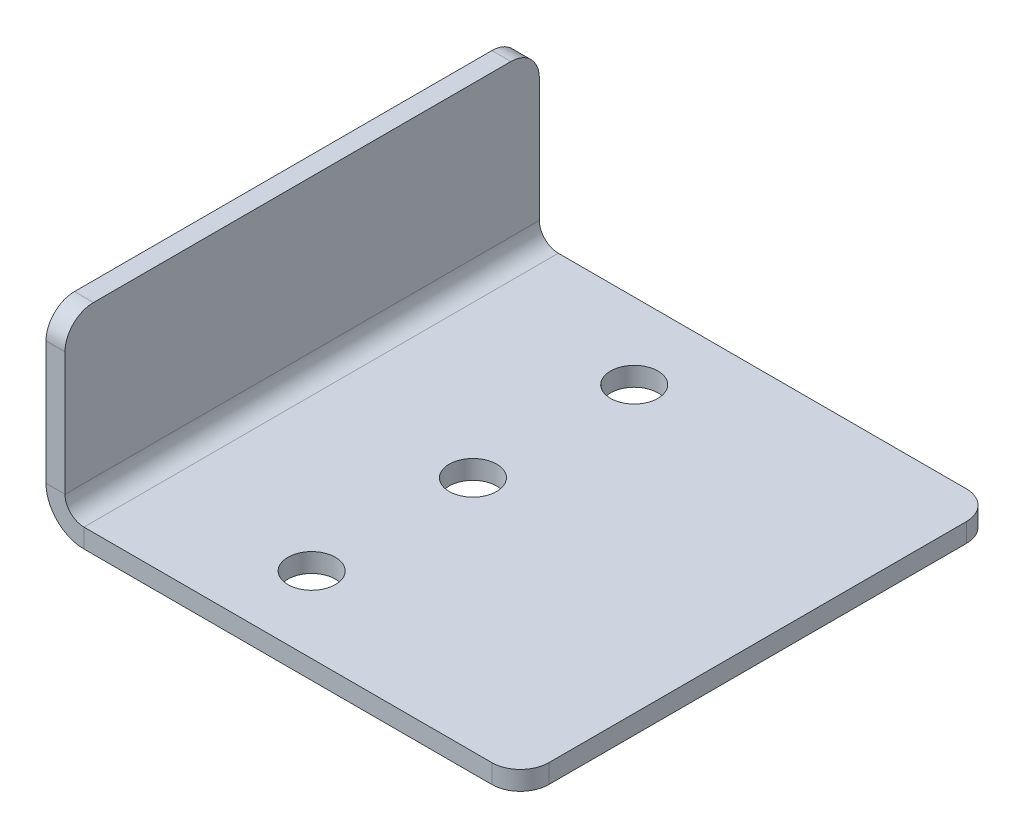
ISO-10303-21;
HEADER;
FILE_DESCRIPTION(('STEP AP214'),'2;1');
FILE_NAME('part.step','',(''),(''),'','','');
FILE_SCHEMA(('AUTOMOTIVE_DESIGN { 1 0 10303 214 1 1 1 1 }'));
ENDSEC;
DATA;
#1=APPLICATION_CONTEXT('core data for automotive mechanical design processes');
#2=APPLICATION_PROTOCOL_DEFINITION('international standard','automotive_design',2000,#1);
#3=PRODUCT_CONTEXT('',#1,'mechanical');
#4=PRODUCT('Part','Part','',(#3));
#5=PRODUCT_RELATED_PRODUCT_CATEGORY('part','',(#4));
#6=PRODUCT_DEFINITION_FORMATION('','',#4);
#7=PRODUCT_DEFINITION_CONTEXT('part definition',#1,'design');
#8=PRODUCT_DEFINITION('design','',#6,#7);
#9=PRODUCT_DEFINITION_SHAPE('','',#8);
#10=(LENGTH_UNIT() NAMED_UNIT(*) SI_UNIT(.MILLI.,.METRE.));
#11=(NAMED_UNIT(*) PLANE_ANGLE_UNIT() SI_UNIT($,.RADIAN.));
#12=(NAMED_UNIT(*) SI_UNIT($,.STERADIAN.) SOLID_ANGLE_UNIT());
#13=UNCERTAINTY_MEASURE_WITH_UNIT(LENGTH_MEASURE(1.E-05),#10,'distance_accuracy_value','');
#14=(GEOMETRIC_REPRESENTATION_CONTEXT(3) GLOBAL_UNCERTAINTY_ASSIGNED_CONTEXT((#13)) GLOBAL_UNIT_ASSIGNED_CONTEXT((#10,
#11,#12)) REPRESENTATION_CONTEXT('',''));
#15=CARTESIAN_POINT('',(0.,0.,0.));
#16=DIRECTION('',(0.,0.,1.));
#17=DIRECTION('',(1.,0.,0.));
#18=AXIS2_PLACEMENT_3D('',#15,#16,#17);
#19=CARTESIAN_POINT('',(25.,2.,25.));
#20=DIRECTION('',(0.,0.,-1.));
#21=DIRECTION('',(-1.,0.,0.));
#22=AXIS2_PLACEMENT_3D('',#19,#20,#21);
#23=PLANE('',#22);
#24=DIRECTION('',(1.,0.,0.));
#25=VECTOR('',#24,1.);
#26=CARTESIAN_POINT('',(25.,0.,25.));
#27=LINE('',#26,#25);
#28=CARTESIAN_POINT('',(-21.,0.,25.));
#29=VERTEX_POINT('',#28);
#30=CARTESIAN_POINT('',(22.,0.,25.));
#31=VERTEX_POINT('',#30);
#32=EDGE_CURVE('E233',#29,#31,#27,.T.);
#33=ORIENTED_EDGE('',*,*,#32,.T.);
#34=DIRECTION('',(0.,-1.,0.));
#35=VECTOR('',#34,1.);
#36=CARTESIAN_POINT('',(22.,2.,25.));
#37=LINE('',#36,#35);
#38=CARTESIAN_POINT('',(22.,2.,25.));
#39=VERTEX_POINT('',#38);
#40=EDGE_CURVE('E13',#31,#39,#37,.F.);
#41=ORIENTED_EDGE('',*,*,#40,.T.);
#42=DIRECTION('',(1.,0.,0.));
#43=VECTOR('',#42,1.);
#44=CARTESIAN_POINT('',(25.,2.,25.));
#45=LINE('',#44,#43);
#46=CARTESIAN_POINT('',(-21.,2.,25.));
#47=VERTEX_POINT('',#46);
#48=EDGE_CURVE('E236',#47,#39,#45,.T.);
#49=ORIENTED_EDGE('',*,*,#48,.F.);
#50=DIRECTION('',(0.,-1.,0.));
#51=VECTOR('',#50,1.);
#52=CARTESIAN_POINT('',(-21.,2.,25.));
#53=LINE('',#52,#51);
#54=EDGE_CURVE('E218',#47,#29,#53,.T.);
#55=ORIENTED_EDGE('',*,*,#54,.T.);
#56=EDGE_LOOP('',(#33,#41,#49,#55));
#57=FACE_BOUND('',#56,.T.);
#58=ADVANCED_FACE('F64',(#57),#23,.F.);
#59=CARTESIAN_POINT('',(25.,2.,-25.));
#60=DIRECTION('',(0.,0.,1.));
#61=DIRECTION('',(1.,0.,0.));
#62=AXIS2_PLACEMENT_3D('',#59,#60,#61);
#63=PLANE('',#62);
#64=DIRECTION('',(-1.,0.,0.));
#65=VECTOR('',#64,1.);
#66=CARTESIAN_POINT('',(25.,2.,-25.));
#67=LINE('',#66,#65);
#68=CARTESIAN_POINT('',(22.,2.,-25.));
#69=VERTEX_POINT('',#68);
#70=CARTESIAN_POINT('',(-21.,2.,-25.));
#71=VERTEX_POINT('',#70);
#72=EDGE_CURVE('E243',#69,#71,#67,.T.);
#73=ORIENTED_EDGE('',*,*,#72,.F.);
#74=DIRECTION('',(0.,-1.,0.));
#75=VECTOR('',#74,1.);
#76=CARTESIAN_POINT('',(22.,2.,-25.));
#77=LINE('',#76,#75);
#78=CARTESIAN_POINT('',(22.,0.,-25.));
#79=VERTEX_POINT('',#78);
#80=EDGE_CURVE('E276',#69,#79,#77,.T.);
#81=ORIENTED_EDGE('',*,*,#80,.T.);
#82=DIRECTION('',(-1.,0.,0.));
#83=VECTOR('',#82,1.);
#84=CARTESIAN_POINT('',(25.,0.,-25.));
#85=LINE('',#84,#83);
#86=CARTESIAN_POINT('',(-21.,0.,-25.));
#87=VERTEX_POINT('',#86);
#88=EDGE_CURVE('E240',#79,#87,#85,.T.);
#89=ORIENTED_EDGE('',*,*,#88,.T.);
#90=DIRECTION('',(0.,-1.,0.));
#91=VECTOR('',#90,1.);
#92=CARTESIAN_POINT('',(-21.,2.,-25.));
#93=LINE('',#92,#91);
#94=EDGE_CURVE('E229',#71,#87,#93,.T.);
#95=ORIENTED_EDGE('',*,*,#94,.F.);
#96=EDGE_LOOP('',(#73,#81,#89,#95));
#97=FACE_BOUND('',#96,.T.);
#98=ADVANCED_FACE('F378',(#97),#63,.F.);
#99=CARTESIAN_POINT('',(0.,2.,0.));
#100=DIRECTION('',(0.,1.,0.));
#101=DIRECTION('',(0.,0.,1.));
#102=AXIS2_PLACEMENT_3D('',#99,#100,#101);
#103=PLANE('',#102);
#104=CARTESIAN_POINT('',(-5.,2.,-17.));
#105=DIRECTION('',(0.,1.,0.));
#106=DIRECTION('',(0.,0.,1.));
#107=AXIS2_PLACEMENT_3D('',#104,#105,#106);
#108=CIRCLE('',#107,2.49999999999999);
#109=CARTESIAN_POINT('',(-5.,2.,-14.5));
#110=VERTEX_POINT('',#109);
#111=EDGE_CURVE('E366',#110,#110,#108,.T.);
#112=ORIENTED_EDGE('',*,*,#111,.F.);
#113=EDGE_LOOP('',(#112));
#114=FACE_BOUND('',#113,.T.);
#115=CARTESIAN_POINT('',(-5.,2.,0.));
#116=DIRECTION('',(0.,1.,0.));
#117=DIRECTION('',(0.,0.,1.));
#118=AXIS2_PLACEMENT_3D('',#115,#116,#117);
#119=CIRCLE('',#118,2.49999999999999);
#120=CARTESIAN_POINT('',(-5.,2.,2.49999999999999));
#121=VERTEX_POINT('',#120);
#122=EDGE_CURVE('E358',#121,#121,#119,.T.);
#123=ORIENTED_EDGE('',*,*,#122,.F.);
#124=EDGE_LOOP('',(#123));
#125=FACE_BOUND('',#124,.T.);
#126=CARTESIAN_POINT('',(-5.,2.,17.));
#127=DIRECTION('',(0.,1.,0.));
#128=DIRECTION('',(0.,0.,1.));
#129=AXIS2_PLACEMENT_3D('',#126,#127,#128);
#130=CIRCLE('',#129,2.49999999999999);
#131=CARTESIAN_POINT('',(-5.,2.,19.5));
#132=VERTEX_POINT('',#131);
#133=EDGE_CURVE('E350',#132,#132,#130,.T.);
#134=ORIENTED_EDGE('',*,*,#133,.F.);
#135=EDGE_LOOP('',(#134));
#136=FACE_BOUND('',#135,.T.);
#137=DIRECTION('',(0.,0.,-1.));
#138=VECTOR('',#137,1.);
#139=CARTESIAN_POINT('',(25.,2.,25.));
#140=LINE('',#139,#138);
#141=CARTESIAN_POINT('',(25.,2.,22.));
#142=VERTEX_POINT('',#141);
#143=CARTESIAN_POINT('',(25.,2.,-22.));
#144=VERTEX_POINT('',#143);
#145=EDGE_CURVE('E239',#142,#144,#140,.T.);
#146=ORIENTED_EDGE('',*,*,#145,.T.);
#147=CARTESIAN_POINT('',(22.,2.,-22.));
#148=DIRECTION('',(0.,1.,0.));
#149=DIRECTION('',(0.,0.,1.));
#150=AXIS2_PLACEMENT_3D('',#147,#148,#149);
#151=CIRCLE('',#150,3.);
#152=EDGE_CURVE('E295',#144,#69,#151,.T.);
#153=ORIENTED_EDGE('',*,*,#152,.T.);
#154=ORIENTED_EDGE('',*,*,#72,.T.);
#155=DIRECTION('',(0.,0.,1.));
#156=VECTOR('',#155,1.);
#157=CARTESIAN_POINT('',(-21.,2.,25.));
#158=LINE('',#157,#156);
#159=EDGE_CURVE('E223',#47,#71,#158,.F.);
#160=ORIENTED_EDGE('',*,*,#159,.F.);
#161=ORIENTED_EDGE('',*,*,#48,.T.);
#162=CARTESIAN_POINT('',(22.,2.,22.));
#163=DIRECTION('',(0.,1.,0.));
#164=DIRECTION('',(0.,0.,1.));
#165=AXIS2_PLACEMENT_3D('',#162,#163,#164);
#166=CIRCLE('',#165,3.);
#167=EDGE_CURVE('E292',#39,#142,#166,.T.);
#168=ORIENTED_EDGE('',*,*,#167,.T.);
#169=EDGE_LOOP('',(#146,#153,#154,#160,#161,#168));
#170=FACE_BOUND('',#169,.T.);
#171=ADVANCED_FACE('F374',(#114,#125,#136,#170),#103,.T.);
#172=CARTESIAN_POINT('',(0.,0.,0.));
#173=DIRECTION('',(0.,1.,0.));
#174=DIRECTION('',(0.,0.,1.));
#175=AXIS2_PLACEMENT_3D('',#172,#173,#174);
#176=PLANE('',#175);
#177=CARTESIAN_POINT('',(-5.,0.,-17.));
#178=DIRECTION('',(0.,1.,0.));
#179=DIRECTION('',(0.,0.,1.));
#180=AXIS2_PLACEMENT_3D('',#177,#178,#179);
#181=CIRCLE('',#180,2.5);
#182=CARTESIAN_POINT('',(-5.,0.,-14.5));
#183=VERTEX_POINT('',#182);
#184=EDGE_CURVE('E362',#183,#183,#181,.T.);
#185=ORIENTED_EDGE('',*,*,#184,.T.);
#186=EDGE_LOOP('',(#185));
#187=FACE_BOUND('',#186,.T.);
#188=CARTESIAN_POINT('',(-5.,0.,0.));
#189=DIRECTION('',(0.,1.,0.));
#190=DIRECTION('',(0.,0.,1.));
#191=AXIS2_PLACEMENT_3D('',#188,#189,#190);
#192=CIRCLE('',#191,2.5);
#193=CARTESIAN_POINT('',(-5.,0.,2.5));
#194=VERTEX_POINT('',#193);
#195=EDGE_CURVE('E354',#194,#194,#192,.T.);
#196=ORIENTED_EDGE('',*,*,#195,.T.);
#197=EDGE_LOOP('',(#196));
#198=FACE_BOUND('',#197,.T.);
#199=CARTESIAN_POINT('',(-5.,0.,17.));
#200=DIRECTION('',(0.,1.,0.));
#201=DIRECTION('',(0.,0.,1.));
#202=AXIS2_PLACEMENT_3D('',#199,#200,#201);
#203=CIRCLE('',#202,2.5);
#204=CARTESIAN_POINT('',(-5.,0.,19.5));
#205=VERTEX_POINT('',#204);
#206=EDGE_CURVE('E213',#205,#205,#203,.T.);
#207=ORIENTED_EDGE('',*,*,#206,.T.);
#208=EDGE_LOOP('',(#207));
#209=FACE_BOUND('',#208,.T.);
#210=ORIENTED_EDGE('',*,*,#88,.F.);
#211=CARTESIAN_POINT('',(22.,0.,-22.));
#212=DIRECTION('',(0.,1.,0.));
#213=DIRECTION('',(0.,0.,1.));
#214=AXIS2_PLACEMENT_3D('',#211,#212,#213);
#215=CIRCLE('',#214,3.);
#216=CARTESIAN_POINT('',(25.,0.,-22.));
#217=VERTEX_POINT('',#216);
#218=EDGE_CURVE('E283',#79,#217,#215,.F.);
#219=ORIENTED_EDGE('',*,*,#218,.T.);
#220=DIRECTION('',(0.,0.,-1.));
#221=VECTOR('',#220,1.);
#222=CARTESIAN_POINT('',(25.,0.,25.));
#223=LINE('',#222,#221);
#224=CARTESIAN_POINT('',(25.,0.,22.));
#225=VERTEX_POINT('',#224);
#226=EDGE_CURVE('E249',#225,#217,#223,.T.);
#227=ORIENTED_EDGE('',*,*,#226,.F.);
#228=CARTESIAN_POINT('',(22.,0.,22.));
#229=DIRECTION('',(0.,1.,0.));
#230=DIRECTION('',(0.,0.,1.));
#231=AXIS2_PLACEMENT_3D('',#228,#229,#230);
#232=CIRCLE('',#231,3.);
#233=EDGE_CURVE('E280',#225,#31,#232,.F.);
#234=ORIENTED_EDGE('',*,*,#233,.T.);
#235=ORIENTED_EDGE('',*,*,#32,.F.);
#236=DIRECTION('',(0.,0.,1.));
#237=VECTOR('',#236,1.);
#238=CARTESIAN_POINT('',(-21.,0.,25.));
#239=LINE('',#238,#237);
#240=EDGE_CURVE('E179',#29,#87,#239,.F.);
#241=ORIENTED_EDGE('',*,*,#240,.T.);
#242=EDGE_LOOP('',(#210,#219,#227,#234,#235,#241));
#243=FACE_BOUND('',#242,.T.);
#244=ADVANCED_FACE('F377',(#187,#198,#209,#243),#176,.F.);
#245=CARTESIAN_POINT('',(25.,2.,25.));
#246=DIRECTION('',(-1.,0.,0.));
#247=DIRECTION('',(0.,0.,1.));
#248=AXIS2_PLACEMENT_3D('',#245,#246,#247);
#249=PLANE('',#248);
#250=ORIENTED_EDGE('',*,*,#226,.T.);
#251=DIRECTION('',(0.,-1.,0.));
#252=VECTOR('',#251,1.);
#253=CARTESIAN_POINT('',(25.,2.,-22.));
#254=LINE('',#253,#252);
#255=EDGE_CURVE('E86',#217,#144,#254,.F.);
#256=ORIENTED_EDGE('',*,*,#255,.T.);
#257=ORIENTED_EDGE('',*,*,#145,.F.);
#258=DIRECTION('',(0.,-1.,0.));
#259=VECTOR('',#258,1.);
#260=CARTESIAN_POINT('',(25.,2.,22.));
#261=LINE('',#260,#259);
#262=EDGE_CURVE('E286',#142,#225,#261,.T.);
#263=ORIENTED_EDGE('',*,*,#262,.T.);
#264=EDGE_LOOP('',(#250,#256,#257,#263));
#265=FACE_BOUND('',#264,.T.);
#266=ADVANCED_FACE('F404',(#265),#249,.F.);
#267=CARTESIAN_POINT('',(-21.,4.,-25.));
#268=DIRECTION('',(0.,0.,-1.));
#269=DIRECTION('',(-1.,0.,0.));
#270=AXIS2_PLACEMENT_3D('',#267,#268,#269);
#271=PLANE('',#270);
#272=DIRECTION('',(-1.,0.,0.));
#273=VECTOR('',#272,1.);
#274=CARTESIAN_POINT('',(-25.,3.99999999999999,-25.));
#275=LINE('',#274,#273);
#276=CARTESIAN_POINT('',(-23.,4.,-25.));
#277=VERTEX_POINT('',#276);
#278=CARTESIAN_POINT('',(-25.,3.99999999999999,-25.));
#279=VERTEX_POINT('',#278);
#280=EDGE_CURVE('E209',#277,#279,#275,.T.);
#281=ORIENTED_EDGE('',*,*,#280,.F.);
#282=CARTESIAN_POINT('',(-21.,4.,-25.));
#283=DIRECTION('',(0.,0.,1.));
#284=DIRECTION('',(1.,0.,0.));
#285=AXIS2_PLACEMENT_3D('',#282,#283,#284);
#286=CIRCLE('',#285,2.);
#287=EDGE_CURVE('E183',#71,#277,#286,.F.);
#288=ORIENTED_EDGE('',*,*,#287,.F.);
#289=ORIENTED_EDGE('',*,*,#94,.T.);
#290=CARTESIAN_POINT('',(-21.,4.,-25.));
#291=DIRECTION('',(0.,0.,1.));
#292=DIRECTION('',(1.,0.,0.));
#293=AXIS2_PLACEMENT_3D('',#290,#291,#292);
#294=CIRCLE('',#293,4.);
#295=EDGE_CURVE('E216',#87,#279,#294,.F.);
#296=ORIENTED_EDGE('',*,*,#295,.T.);
#297=EDGE_LOOP('',(#281,#288,#289,#296));
#298=FACE_BOUND('',#297,.T.);
#299=ADVANCED_FACE('F399',(#298),#271,.T.);
#300=CARTESIAN_POINT('',(-21.,4.,25.));
#301=DIRECTION('',(0.,0.,-1.));
#302=DIRECTION('',(-1.,0.,0.));
#303=AXIS2_PLACEMENT_3D('',#300,#301,#302);
#304=PLANE('',#303);
#305=CARTESIAN_POINT('',(-21.,4.,25.));
#306=DIRECTION('',(0.,0.,1.));
#307=DIRECTION('',(1.,0.,0.));
#308=AXIS2_PLACEMENT_3D('',#305,#306,#307);
#309=CIRCLE('',#308,2.);
#310=CARTESIAN_POINT('',(-23.,4.,25.));
#311=VERTEX_POINT('',#310);
#312=EDGE_CURVE('E167',#311,#47,#309,.T.);
#313=ORIENTED_EDGE('',*,*,#312,.F.);
#314=DIRECTION('',(-1.,0.,0.));
#315=VECTOR('',#314,1.);
#316=CARTESIAN_POINT('',(-23.,4.,25.));
#317=LINE('',#316,#315);
#318=CARTESIAN_POINT('',(-25.,3.99999999999999,25.));
#319=VERTEX_POINT('',#318);
#320=EDGE_CURVE('E161',#311,#319,#317,.T.);
#321=ORIENTED_EDGE('',*,*,#320,.T.);
#322=CARTESIAN_POINT('',(-21.,4.,25.));
#323=DIRECTION('',(0.,0.,1.));
#324=DIRECTION('',(1.,0.,0.));
#325=AXIS2_PLACEMENT_3D('',#322,#323,#324);
#326=CIRCLE('',#325,4.);
#327=EDGE_CURVE('E173',#319,#29,#326,.T.);
#328=ORIENTED_EDGE('',*,*,#327,.T.);
#329=ORIENTED_EDGE('',*,*,#54,.F.);
#330=EDGE_LOOP('',(#313,#321,#328,#329));
#331=FACE_BOUND('',#330,.T.);
#332=ADVANCED_FACE('F186',(#331),#304,.F.);
#333=CARTESIAN_POINT('',(-21.,4.,25.));
#334=DIRECTION('',(0.,0.,1.));
#335=DIRECTION('',(-1.,0.,0.));
#336=AXIS2_PLACEMENT_3D('',#333,#334,#335);
#337=CYLINDRICAL_SURFACE('',#336,4.);
#338=ORIENTED_EDGE('',*,*,#240,.F.);
#339=ORIENTED_EDGE('',*,*,#327,.F.);
#340=DIRECTION('',(0.,0.,1.));
#341=VECTOR('',#340,1.);
#342=CARTESIAN_POINT('',(-25.,3.99999999999999,0.));
#343=LINE('',#342,#341);
#344=EDGE_CURVE('E176',#279,#319,#343,.T.);
#345=ORIENTED_EDGE('',*,*,#344,.F.);
#346=ORIENTED_EDGE('',*,*,#295,.F.);
#347=EDGE_LOOP('',(#338,#339,#345,#346));
#348=FACE_BOUND('',#347,.T.);
#349=ADVANCED_FACE('F174',(#348),#337,.T.);
#350=CARTESIAN_POINT('',(-21.,4.,25.));
#351=DIRECTION('',(0.,0.,1.));
#352=DIRECTION('',(-1.,0.,0.));
#353=AXIS2_PLACEMENT_3D('',#350,#351,#352);
#354=CYLINDRICAL_SURFACE('',#353,2.);
#355=ORIENTED_EDGE('',*,*,#159,.T.);
#356=ORIENTED_EDGE('',*,*,#287,.T.);
#357=DIRECTION('',(0.,0.,-1.));
#358=VECTOR('',#357,1.);
#359=CARTESIAN_POINT('',(-23.,4.,-25.));
#360=LINE('',#359,#358);
#361=EDGE_CURVE('E189',#277,#311,#360,.F.);
#362=ORIENTED_EDGE('',*,*,#361,.T.);
#363=ORIENTED_EDGE('',*,*,#312,.T.);
#364=EDGE_LOOP('',(#355,#356,#362,#363));
#365=FACE_BOUND('',#364,.T.);
#366=ADVANCED_FACE('F401',(#365),#354,.F.);
#367=CARTESIAN_POINT('',(-25.,1.99999999999999,25.));
#368=DIRECTION('',(0.,0.,1.));
#369=DIRECTION('',(1.,0.,0.));
#370=AXIS2_PLACEMENT_3D('',#367,#368,#369);
#371=PLANE('',#370);
#372=DIRECTION('',(0.,1.,0.));
#373=VECTOR('',#372,1.);
#374=CARTESIAN_POINT('',(-23.,0.,25.));
#375=LINE('',#374,#373);
#376=CARTESIAN_POINT('',(-23.0000000000001,17.,25.));
#377=VERTEX_POINT('',#376);
#378=EDGE_CURVE('E336',#377,#311,#375,.F.);
#379=ORIENTED_EDGE('',*,*,#378,.F.);
#380=DIRECTION('',(1.,0.,0.));
#381=VECTOR('',#380,1.);
#382=CARTESIAN_POINT('',(-25.0000000000001,17.,25.));
#383=LINE('',#382,#381);
#384=CARTESIAN_POINT('',(-25.0000000000001,17.,25.));
#385=VERTEX_POINT('',#384);
#386=EDGE_CURVE('E73',#377,#385,#383,.F.);
#387=ORIENTED_EDGE('',*,*,#386,.T.);
#388=DIRECTION('',(0.,-1.,0.));
#389=VECTOR('',#388,1.);
#390=CARTESIAN_POINT('',(-25.,1.99999999999999,25.));
#391=LINE('',#390,#389);
#392=EDGE_CURVE('E156',#385,#319,#391,.T.);
#393=ORIENTED_EDGE('',*,*,#392,.T.);
#394=ORIENTED_EDGE('',*,*,#320,.F.);
#395=EDGE_LOOP('',(#379,#387,#393,#394));
#396=FACE_BOUND('',#395,.T.);
#397=ADVANCED_FACE('F159',(#396),#371,.T.);
#398=CARTESIAN_POINT('',(-25.0000000000001,20.,-25.));
#399=DIRECTION('',(0.,0.,-1.));
#400=DIRECTION('',(-1.,0.,0.));
#401=AXIS2_PLACEMENT_3D('',#398,#399,#400);
#402=PLANE('',#401);
#403=DIRECTION('',(0.,1.,0.));
#404=VECTOR('',#403,1.);
#405=CARTESIAN_POINT('',(-25.0000000000001,20.,-25.));
#406=LINE('',#405,#404);
#407=CARTESIAN_POINT('',(-25.0000000000001,17.,-25.));
#408=VERTEX_POINT('',#407);
#409=EDGE_CURVE('E195',#279,#408,#406,.T.);
#410=ORIENTED_EDGE('',*,*,#409,.T.);
#411=DIRECTION('',(1.,0.,0.));
#412=VECTOR('',#411,1.);
#413=CARTESIAN_POINT('',(-25.0000000000001,17.,-25.));
#414=LINE('',#413,#412);
#415=CARTESIAN_POINT('',(-23.0000000000001,17.,-25.));
#416=VERTEX_POINT('',#415);
#417=EDGE_CURVE('E246',#408,#416,#414,.T.);
#418=ORIENTED_EDGE('',*,*,#417,.T.);
#419=DIRECTION('',(0.,-1.,0.));
#420=VECTOR('',#419,1.);
#421=CARTESIAN_POINT('',(-23.,0.,-25.));
#422=LINE('',#421,#420);
#423=EDGE_CURVE('E197',#277,#416,#422,.F.);
#424=ORIENTED_EDGE('',*,*,#423,.F.);
#425=ORIENTED_EDGE('',*,*,#280,.T.);
#426=EDGE_LOOP('',(#410,#418,#424,#425));
#427=FACE_BOUND('',#426,.T.);
#428=ADVANCED_FACE('F441',(#427),#402,.T.);
#429=CARTESIAN_POINT('',(-25.,0.,0.));
#430=DIRECTION('',(-1.,0.,0.));
#431=DIRECTION('',(0.,-1.,0.));
#432=AXIS2_PLACEMENT_3D('',#429,#430,#431);
#433=PLANE('',#432);
#434=DIRECTION('',(0.,0.,1.));
#435=VECTOR('',#434,1.);
#436=CARTESIAN_POINT('',(-25.0000000000001,20.,25.));
#437=LINE('',#436,#435);
#438=CARTESIAN_POINT('',(-25.0000000000001,20.,-22.));
#439=VERTEX_POINT('',#438);
#440=CARTESIAN_POINT('',(-25.0000000000001,20.,22.));
#441=VERTEX_POINT('',#440);
#442=EDGE_CURVE('E168',#439,#441,#437,.T.);
#443=ORIENTED_EDGE('',*,*,#442,.F.);
#444=CARTESIAN_POINT('',(-25.0000000000001,17.,-22.));
#445=DIRECTION('',(-1.,0.,0.));
#446=DIRECTION('',(0.,-1.,0.));
#447=AXIS2_PLACEMENT_3D('',#444,#445,#446);
#448=CIRCLE('',#447,3.);
#449=EDGE_CURVE('E273',#439,#408,#448,.T.);
#450=ORIENTED_EDGE('',*,*,#449,.T.);
#451=ORIENTED_EDGE('',*,*,#409,.F.);
#452=ORIENTED_EDGE('',*,*,#344,.T.);
#453=ORIENTED_EDGE('',*,*,#392,.F.);
#454=CARTESIAN_POINT('',(-25.0000000000001,17.,22.));
#455=DIRECTION('',(-1.,0.,0.));
#456=DIRECTION('',(0.,-1.,0.));
#457=AXIS2_PLACEMENT_3D('',#454,#455,#456);
#458=CIRCLE('',#457,3.);
#459=EDGE_CURVE('E270',#385,#441,#458,.T.);
#460=ORIENTED_EDGE('',*,*,#459,.T.);
#461=EDGE_LOOP('',(#443,#450,#451,#452,#453,#460));
#462=FACE_BOUND('',#461,.T.);
#463=ADVANCED_FACE('F193',(#462),#433,.T.);
#464=CARTESIAN_POINT('',(-23.,0.,0.));
#465=DIRECTION('',(-1.,0.,0.));
#466=DIRECTION('',(0.,-1.,0.));
#467=AXIS2_PLACEMENT_3D('',#464,#465,#466);
#468=PLANE('',#467);
#469=ORIENTED_EDGE('',*,*,#423,.T.);
#470=CARTESIAN_POINT('',(-23.0000000000001,17.,-22.));
#471=DIRECTION('',(-1.,0.,0.));
#472=DIRECTION('',(0.,-1.,0.));
#473=AXIS2_PLACEMENT_3D('',#470,#471,#472);
#474=CIRCLE('',#473,3.);
#475=CARTESIAN_POINT('',(-23.0000000000001,20.,-22.));
#476=VERTEX_POINT('',#475);
#477=EDGE_CURVE('E260',#416,#476,#474,.F.);
#478=ORIENTED_EDGE('',*,*,#477,.T.);
#479=DIRECTION('',(0.,0.,-1.));
#480=VECTOR('',#479,1.);
#481=CARTESIAN_POINT('',(-23.0000000000001,20.,0.));
#482=LINE('',#481,#480);
#483=CARTESIAN_POINT('',(-23.0000000000001,20.,22.));
#484=VERTEX_POINT('',#483);
#485=EDGE_CURVE('E202',#476,#484,#482,.F.);
#486=ORIENTED_EDGE('',*,*,#485,.T.);
#487=CARTESIAN_POINT('',(-23.0000000000001,17.,22.));
#488=DIRECTION('',(-1.,0.,0.));
#489=DIRECTION('',(0.,-1.,0.));
#490=AXIS2_PLACEMENT_3D('',#487,#488,#489);
#491=CIRCLE('',#490,3.);
#492=EDGE_CURVE('E257',#484,#377,#491,.F.);
#493=ORIENTED_EDGE('',*,*,#492,.T.);
#494=ORIENTED_EDGE('',*,*,#378,.T.);
#495=ORIENTED_EDGE('',*,*,#361,.F.);
#496=EDGE_LOOP('',(#469,#478,#486,#493,#494,#495));
#497=FACE_BOUND('',#496,.T.);
#498=ADVANCED_FACE('F443',(#497),#468,.F.);
#499=CARTESIAN_POINT('',(-25.0000000000001,20.,25.));
#500=DIRECTION('',(0.,1.,0.));
#501=DIRECTION('',(-1.,0.,0.));
#502=AXIS2_PLACEMENT_3D('',#499,#500,#501);
#503=PLANE('',#502);
#504=ORIENTED_EDGE('',*,*,#485,.F.);
#505=DIRECTION('',(1.,0.,0.));
#506=VECTOR('',#505,1.);
#507=CARTESIAN_POINT('',(-25.0000000000001,20.,-22.));
#508=LINE('',#507,#506);
#509=EDGE_CURVE('E267',#476,#439,#508,.F.);
#510=ORIENTED_EDGE('',*,*,#509,.T.);
#511=ORIENTED_EDGE('',*,*,#442,.T.);
#512=DIRECTION('',(1.,0.,0.));
#513=VECTOR('',#512,1.);
#514=CARTESIAN_POINT('',(-25.0000000000001,20.,22.));
#515=LINE('',#514,#513);
#516=EDGE_CURVE('E263',#441,#484,#515,.T.);
#517=ORIENTED_EDGE('',*,*,#516,.T.);
#518=EDGE_LOOP('',(#504,#510,#511,#517));
#519=FACE_BOUND('',#518,.T.);
#520=ADVANCED_FACE('F437',(#519),#503,.T.);
#521=CARTESIAN_POINT('',(-5.,2.,17.));
#522=DIRECTION('',(0.,1.,0.));
#523=DIRECTION('',(0.,0.,1.));
#524=AXIS2_PLACEMENT_3D('',#521,#522,#523);
#525=CYLINDRICAL_SURFACE('',#524,2.49999999999999);
#526=ORIENTED_EDGE('',*,*,#206,.F.);
#527=EDGE_LOOP('',(#526));
#528=FACE_BOUND('',#527,.T.);
#529=ORIENTED_EDGE('',*,*,#133,.T.);
#530=EDGE_LOOP('',(#529));
#531=FACE_BOUND('',#530,.T.);
#532=ADVANCED_FACE('F450',(#528,#531),#525,.F.);
#533=CARTESIAN_POINT('',(-5.,2.,0.));
#534=DIRECTION('',(0.,1.,0.));
#535=DIRECTION('',(0.,0.,1.));
#536=AXIS2_PLACEMENT_3D('',#533,#534,#535);
#537=CYLINDRICAL_SURFACE('',#536,2.49999999999999);
#538=ORIENTED_EDGE('',*,*,#195,.F.);
#539=EDGE_LOOP('',(#538));
#540=FACE_BOUND('',#539,.T.);
#541=ORIENTED_EDGE('',*,*,#122,.T.);
#542=EDGE_LOOP('',(#541));
#543=FACE_BOUND('',#542,.T.);
#544=ADVANCED_FACE('F485',(#540,#543),#537,.F.);
#545=CARTESIAN_POINT('',(-5.,2.,-17.));
#546=DIRECTION('',(0.,1.,0.));
#547=DIRECTION('',(0.,0.,1.));
#548=AXIS2_PLACEMENT_3D('',#545,#546,#547);
#549=CYLINDRICAL_SURFACE('',#548,2.49999999999999);
#550=ORIENTED_EDGE('',*,*,#184,.F.);
#551=EDGE_LOOP('',(#550));
#552=FACE_BOUND('',#551,.T.);
#553=ORIENTED_EDGE('',*,*,#111,.T.);
#554=EDGE_LOOP('',(#553));
#555=FACE_BOUND('',#554,.T.);
#556=ADVANCED_FACE('F372',(#552,#555),#549,.F.);
#557=CARTESIAN_POINT('',(-25.0000000000001,17.,-22.));
#558=DIRECTION('',(1.,0.,0.));
#559=DIRECTION('',(0.,1.,0.));
#560=AXIS2_PLACEMENT_3D('',#557,#558,#559);
#561=CYLINDRICAL_SURFACE('',#560,3.);
#562=ORIENTED_EDGE('',*,*,#449,.F.);
#563=ORIENTED_EDGE('',*,*,#509,.F.);
#564=ORIENTED_EDGE('',*,*,#477,.F.);
#565=ORIENTED_EDGE('',*,*,#417,.F.);
#566=EDGE_LOOP('',(#562,#563,#564,#565));
#567=FACE_BOUND('',#566,.T.);
#568=ADVANCED_FACE('F423',(#567),#561,.T.);
#569=CARTESIAN_POINT('',(22.,2.,-22.));
#570=DIRECTION('',(0.,-1.,0.));
#571=DIRECTION('',(0.,0.,-1.));
#572=AXIS2_PLACEMENT_3D('',#569,#570,#571);
#573=CYLINDRICAL_SURFACE('',#572,3.);
#574=ORIENTED_EDGE('',*,*,#152,.F.);
#575=ORIENTED_EDGE('',*,*,#255,.F.);
#576=ORIENTED_EDGE('',*,*,#218,.F.);
#577=ORIENTED_EDGE('',*,*,#80,.F.);
#578=EDGE_LOOP('',(#574,#575,#576,#577));
#579=FACE_BOUND('',#578,.T.);
#580=ADVANCED_FACE('F390',(#579),#573,.T.);
#581=CARTESIAN_POINT('',(-25.0000000000001,17.,22.));
#582=DIRECTION('',(1.,0.,0.));
#583=DIRECTION('',(0.,1.,0.));
#584=AXIS2_PLACEMENT_3D('',#581,#582,#583);
#585=CYLINDRICAL_SURFACE('',#584,3.);
#586=ORIENTED_EDGE('',*,*,#459,.F.);
#587=ORIENTED_EDGE('',*,*,#386,.F.);
#588=ORIENTED_EDGE('',*,*,#492,.F.);
#589=ORIENTED_EDGE('',*,*,#516,.F.);
#590=EDGE_LOOP('',(#586,#587,#588,#589));
#591=FACE_BOUND('',#590,.T.);
#592=ADVANCED_FACE('F428',(#591),#585,.T.);
#593=CARTESIAN_POINT('',(22.,2.,22.));
#594=DIRECTION('',(0.,-1.,0.));
#595=DIRECTION('',(0.,0.,-1.));
#596=AXIS2_PLACEMENT_3D('',#593,#594,#595);
#597=CYLINDRICAL_SURFACE('',#596,3.);
#598=ORIENTED_EDGE('',*,*,#167,.F.);
#599=ORIENTED_EDGE('',*,*,#40,.F.);
#600=ORIENTED_EDGE('',*,*,#233,.F.);
#601=ORIENTED_EDGE('',*,*,#262,.F.);
#602=EDGE_LOOP('',(#598,#599,#600,#601));
#603=FACE_BOUND('',#602,.T.);
#604=ADVANCED_FACE('F66',(#603),#597,.T.);
#605=CLOSED_SHELL('',(#58,#98,#171,#244,#266,#299,#332,#349,#366,#397,#428,#463,#498,#520,#532,
#544,#556,#568,#580,#592,#604));
#606=MANIFOLD_SOLID_BREP('B2',#605);
#607=ADVANCED_BREP_SHAPE_REPRESENTATION('',(#18,#606),#14);
#608=SHAPE_DEFINITION_REPRESENTATION(#9,#607);
ENDSEC;
END-ISO-10303-21;
